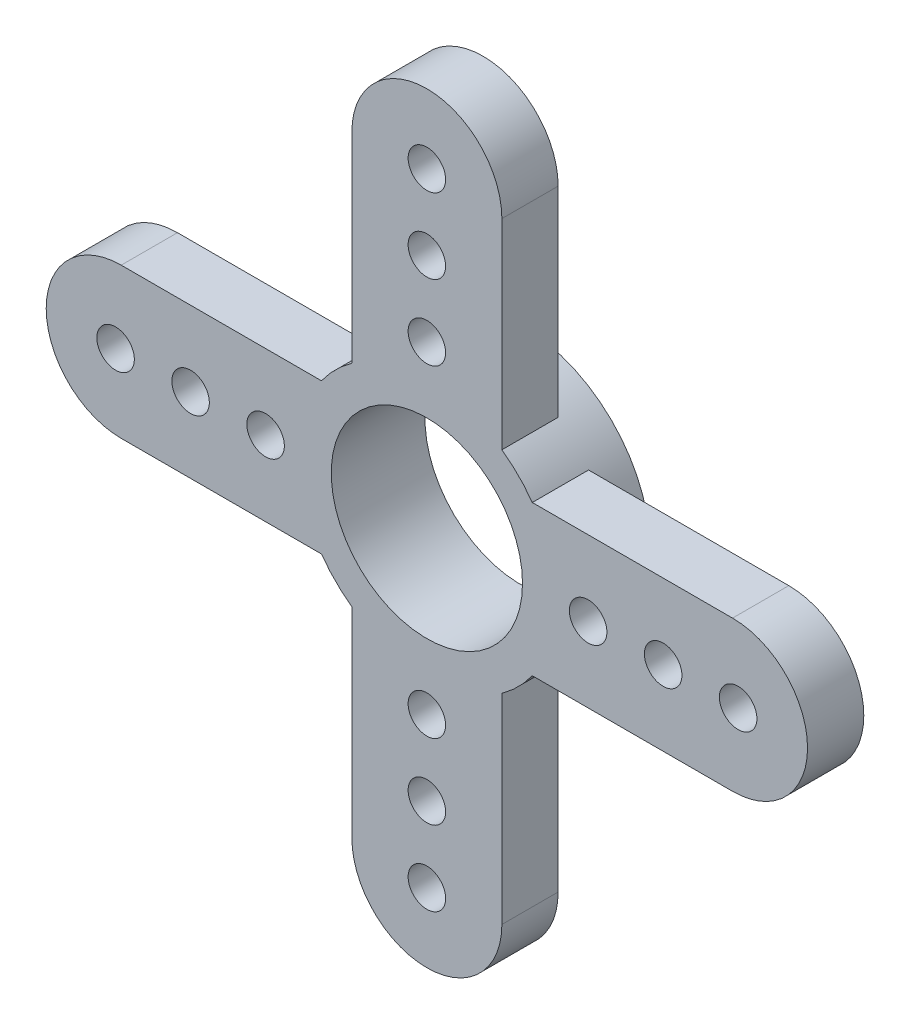
ISO-10303-21;
HEADER;
FILE_DESCRIPTION(('STEP AP214'),'2;1');
FILE_NAME('part.step','',(''),(''),'','','');
FILE_SCHEMA(('AUTOMOTIVE_DESIGN { 1 0 10303 214 1 1 1 1 }'));
ENDSEC;
DATA;
#1=APPLICATION_CONTEXT('core data for automotive mechanical design processes');
#2=APPLICATION_PROTOCOL_DEFINITION('international standard','automotive_design',2000,#1);
#3=PRODUCT_CONTEXT('',#1,'mechanical');
#4=PRODUCT('Part','Part','',(#3));
#5=PRODUCT_RELATED_PRODUCT_CATEGORY('part','',(#4));
#6=PRODUCT_DEFINITION_FORMATION('','',#4);
#7=PRODUCT_DEFINITION_CONTEXT('part definition',#1,'design');
#8=PRODUCT_DEFINITION('design','',#6,#7);
#9=PRODUCT_DEFINITION_SHAPE('','',#8);
#10=(LENGTH_UNIT() NAMED_UNIT(*) SI_UNIT(.MILLI.,.METRE.));
#11=(NAMED_UNIT(*) PLANE_ANGLE_UNIT() SI_UNIT($,.RADIAN.));
#12=(NAMED_UNIT(*) SI_UNIT($,.STERADIAN.) SOLID_ANGLE_UNIT());
#13=UNCERTAINTY_MEASURE_WITH_UNIT(LENGTH_MEASURE(1.E-05),#10,'distance_accuracy_value','');
#14=(GEOMETRIC_REPRESENTATION_CONTEXT(3) GLOBAL_UNCERTAINTY_ASSIGNED_CONTEXT((#13)) GLOBAL_UNIT_ASSIGNED_CONTEXT((#10,
#11,#12)) REPRESENTATION_CONTEXT('',''));
#15=CARTESIAN_POINT('',(0.,0.,0.));
#16=DIRECTION('',(0.,0.,1.));
#17=DIRECTION('',(1.,0.,0.));
#18=AXIS2_PLACEMENT_3D('',#15,#16,#17);
#19=CARTESIAN_POINT('',(0.,0.,0.));
#20=DIRECTION('',(0.,0.,1.));
#21=DIRECTION('',(1.,0.,0.));
#22=AXIS2_PLACEMENT_3D('',#19,#20,#21);
#23=PLANE('',#22);
#24=CARTESIAN_POINT('',(0.,4.3,0.));
#25=DIRECTION('',(0.,0.,1.));
#26=DIRECTION('',(1.,0.,0.));
#27=AXIS2_PLACEMENT_3D('',#24,#25,#26);
#28=CIRCLE('',#27,0.5);
#29=CARTESIAN_POINT('',(0.5,4.3,0.));
#30=VERTEX_POINT('',#29);
#31=EDGE_CURVE('E262',#30,#30,#28,.F.);
#32=ORIENTED_EDGE('',*,*,#31,.F.);
#33=EDGE_LOOP('',(#32));
#34=FACE_BOUND('',#33,.T.);
#35=CARTESIAN_POINT('',(0.,6.3,0.));
#36=DIRECTION('',(0.,0.,1.));
#37=DIRECTION('',(1.,0.,0.));
#38=AXIS2_PLACEMENT_3D('',#35,#36,#37);
#39=CIRCLE('',#38,0.5);
#40=CARTESIAN_POINT('',(0.5,6.3,0.));
#41=VERTEX_POINT('',#40);
#42=EDGE_CURVE('E259',#41,#41,#39,.F.);
#43=ORIENTED_EDGE('',*,*,#42,.F.);
#44=EDGE_LOOP('',(#43));
#45=FACE_BOUND('',#44,.T.);
#46=CARTESIAN_POINT('',(0.,8.3,0.));
#47=DIRECTION('',(0.,0.,1.));
#48=DIRECTION('',(1.,0.,0.));
#49=AXIS2_PLACEMENT_3D('',#46,#47,#48);
#50=CIRCLE('',#49,0.5);
#51=CARTESIAN_POINT('',(0.5,8.3,0.));
#52=VERTEX_POINT('',#51);
#53=EDGE_CURVE('E254',#52,#52,#50,.F.);
#54=ORIENTED_EDGE('',*,*,#53,.F.);
#55=EDGE_LOOP('',(#54));
#56=FACE_BOUND('',#55,.T.);
#57=DIRECTION('',(0.,1.,0.));
#58=VECTOR('',#57,1.);
#59=CARTESIAN_POINT('',(2.,-8.15,0.));
#60=LINE('',#59,#58);
#61=CARTESIAN_POINT('',(2.,2.81113855937412,0.));
#62=VERTEX_POINT('',#61);
#63=CARTESIAN_POINT('',(2.,8.15,0.));
#64=VERTEX_POINT('',#63);
#65=EDGE_CURVE('E169',#62,#64,#60,.T.);
#66=ORIENTED_EDGE('',*,*,#65,.F.);
#67=CARTESIAN_POINT('',(0.,0.,0.));
#68=DIRECTION('',(0.,0.,1.));
#69=DIRECTION('',(1.,0.,0.));
#70=AXIS2_PLACEMENT_3D('',#67,#68,#69);
#71=CIRCLE('',#70,3.45);
#72=CARTESIAN_POINT('',(-2.,2.81113855937412,0.));
#73=VERTEX_POINT('',#72);
#74=EDGE_CURVE('E11',#62,#73,#71,.T.);
#75=ORIENTED_EDGE('',*,*,#74,.T.);
#76=DIRECTION('',(0.,-1.,0.));
#77=VECTOR('',#76,1.);
#78=CARTESIAN_POINT('',(-2.,-8.15,0.));
#79=LINE('',#78,#77);
#80=CARTESIAN_POINT('',(-2.,8.15,0.));
#81=VERTEX_POINT('',#80);
#82=EDGE_CURVE('E179',#81,#73,#79,.T.);
#83=ORIENTED_EDGE('',*,*,#82,.F.);
#84=CARTESIAN_POINT('',(0.,8.15,0.));
#85=DIRECTION('',(0.,0.,1.));
#86=DIRECTION('',(1.,0.,0.));
#87=AXIS2_PLACEMENT_3D('',#84,#85,#86);
#88=CIRCLE('',#87,2.);
#89=EDGE_CURVE('E176',#64,#81,#88,.T.);
#90=ORIENTED_EDGE('',*,*,#89,.F.);
#91=EDGE_LOOP('',(#66,#75,#83,#90));
#92=FACE_BOUND('',#91,.T.);
#93=ADVANCED_FACE('F43',(#34,#45,#56,#92),#23,.F.);
#94=CARTESIAN_POINT('',(-8.3,0.,0.));
#95=DIRECTION('',(0.,0.,1.));
#96=DIRECTION('',(1.,0.,0.));
#97=AXIS2_PLACEMENT_3D('',#94,#95,#96);
#98=CIRCLE('',#97,0.5);
#99=CARTESIAN_POINT('',(-7.8,0.,0.));
#100=VERTEX_POINT('',#99);
#101=EDGE_CURVE('E287',#100,#100,#98,.F.);
#102=ORIENTED_EDGE('',*,*,#101,.F.);
#103=EDGE_LOOP('',(#102));
#104=FACE_BOUND('',#103,.T.);
#105=CARTESIAN_POINT('',(-4.3,0.,0.));
#106=DIRECTION('',(0.,0.,1.));
#107=DIRECTION('',(1.,0.,0.));
#108=AXIS2_PLACEMENT_3D('',#105,#106,#107);
#109=CIRCLE('',#108,0.5);
#110=CARTESIAN_POINT('',(-3.8,0.,0.));
#111=VERTEX_POINT('',#110);
#112=EDGE_CURVE('E274',#111,#111,#109,.F.);
#113=ORIENTED_EDGE('',*,*,#112,.F.);
#114=EDGE_LOOP('',(#113));
#115=FACE_BOUND('',#114,.T.);
#116=CARTESIAN_POINT('',(-6.3,0.,0.));
#117=DIRECTION('',(0.,0.,1.));
#118=DIRECTION('',(1.,0.,0.));
#119=AXIS2_PLACEMENT_3D('',#116,#117,#118);
#120=CIRCLE('',#119,0.5);
#121=CARTESIAN_POINT('',(-5.8,0.,0.));
#122=VERTEX_POINT('',#121);
#123=EDGE_CURVE('E275',#122,#122,#120,.F.);
#124=ORIENTED_EDGE('',*,*,#123,.F.);
#125=EDGE_LOOP('',(#124));
#126=FACE_BOUND('',#125,.T.);
#127=DIRECTION('',(-1.,0.,0.));
#128=VECTOR('',#127,1.);
#129=CARTESIAN_POINT('',(-8.15,2.,0.));
#130=LINE('',#129,#128);
#131=CARTESIAN_POINT('',(-2.81113855937412,2.,0.));
#132=VERTEX_POINT('',#131);
#133=CARTESIAN_POINT('',(-8.15,2.,0.));
#134=VERTEX_POINT('',#133);
#135=EDGE_CURVE('E215',#132,#134,#130,.T.);
#136=ORIENTED_EDGE('',*,*,#135,.F.);
#137=CARTESIAN_POINT('',(-2.81113855937412,-2.,0.));
#138=VERTEX_POINT('',#137);
#139=EDGE_CURVE('E55',#132,#138,#71,.T.);
#140=ORIENTED_EDGE('',*,*,#139,.T.);
#141=DIRECTION('',(1.,0.,0.));
#142=VECTOR('',#141,1.);
#143=CARTESIAN_POINT('',(-8.15,-2.,0.));
#144=LINE('',#143,#142);
#145=CARTESIAN_POINT('',(-8.15,-2.,0.));
#146=VERTEX_POINT('',#145);
#147=EDGE_CURVE('E207',#146,#138,#144,.T.);
#148=ORIENTED_EDGE('',*,*,#147,.F.);
#149=CARTESIAN_POINT('',(-8.15,0.,0.));
#150=DIRECTION('',(0.,0.,1.));
#151=DIRECTION('',(1.,0.,0.));
#152=AXIS2_PLACEMENT_3D('',#149,#150,#151);
#153=CIRCLE('',#152,2.);
#154=EDGE_CURVE('E301',#134,#146,#153,.T.);
#155=ORIENTED_EDGE('',*,*,#154,.F.);
#156=EDGE_LOOP('',(#136,#140,#148,#155));
#157=FACE_BOUND('',#156,.T.);
#158=ADVANCED_FACE('F365',(#104,#115,#126,#157),#23,.F.);
#159=CARTESIAN_POINT('',(0.,-8.3,0.));
#160=DIRECTION('',(0.,0.,1.));
#161=DIRECTION('',(1.,0.,0.));
#162=AXIS2_PLACEMENT_3D('',#159,#160,#161);
#163=CIRCLE('',#162,0.5);
#164=CARTESIAN_POINT('',(0.5,-8.3,0.));
#165=VERTEX_POINT('',#164);
#166=EDGE_CURVE('E283',#165,#165,#163,.F.);
#167=ORIENTED_EDGE('',*,*,#166,.F.);
#168=EDGE_LOOP('',(#167));
#169=FACE_BOUND('',#168,.T.);
#170=CARTESIAN_POINT('',(0.,-6.3,0.));
#171=DIRECTION('',(0.,0.,1.));
#172=DIRECTION('',(1.,0.,0.));
#173=AXIS2_PLACEMENT_3D('',#170,#171,#172);
#174=CIRCLE('',#173,0.5);
#175=CARTESIAN_POINT('',(0.5,-6.3,0.));
#176=VERTEX_POINT('',#175);
#177=EDGE_CURVE('E284',#176,#176,#174,.F.);
#178=ORIENTED_EDGE('',*,*,#177,.F.);
#179=EDGE_LOOP('',(#178));
#180=FACE_BOUND('',#179,.T.);
#181=CARTESIAN_POINT('',(0.,-4.3,0.));
#182=DIRECTION('',(0.,0.,1.));
#183=DIRECTION('',(1.,0.,0.));
#184=AXIS2_PLACEMENT_3D('',#181,#182,#183);
#185=CIRCLE('',#184,0.5);
#186=CARTESIAN_POINT('',(0.5,-4.3,0.));
#187=VERTEX_POINT('',#186);
#188=EDGE_CURVE('E279',#187,#187,#185,.F.);
#189=ORIENTED_EDGE('',*,*,#188,.F.);
#190=EDGE_LOOP('',(#189));
#191=FACE_BOUND('',#190,.T.);
#192=CARTESIAN_POINT('',(-2.,-2.81113855937412,0.));
#193=VERTEX_POINT('',#192);
#194=CARTESIAN_POINT('',(-2.,-8.15,0.));
#195=VERTEX_POINT('',#194);
#196=EDGE_CURVE('E185',#193,#195,#79,.T.);
#197=ORIENTED_EDGE('',*,*,#196,.F.);
#198=CARTESIAN_POINT('',(2.,-2.81113855937412,0.));
#199=VERTEX_POINT('',#198);
#200=EDGE_CURVE('E358',#193,#199,#71,.T.);
#201=ORIENTED_EDGE('',*,*,#200,.T.);
#202=CARTESIAN_POINT('',(2.,-8.15,0.));
#203=VERTEX_POINT('',#202);
#204=EDGE_CURVE('E177',#203,#199,#60,.T.);
#205=ORIENTED_EDGE('',*,*,#204,.F.);
#206=CARTESIAN_POINT('',(0.,-8.15,0.));
#207=DIRECTION('',(0.,0.,1.));
#208=DIRECTION('',(1.,0.,0.));
#209=AXIS2_PLACEMENT_3D('',#206,#207,#208);
#210=CIRCLE('',#209,2.);
#211=EDGE_CURVE('E313',#195,#203,#210,.T.);
#212=ORIENTED_EDGE('',*,*,#211,.F.);
#213=EDGE_LOOP('',(#197,#201,#205,#212));
#214=FACE_BOUND('',#213,.T.);
#215=ADVANCED_FACE('F368',(#169,#180,#191,#214),#23,.F.);
#216=CARTESIAN_POINT('',(0.,0.,1.5));
#217=DIRECTION('',(0.,0.,-1.));
#218=DIRECTION('',(-1.,0.,0.));
#219=AXIS2_PLACEMENT_3D('',#216,#217,#218);
#220=CYLINDRICAL_SURFACE('',#219,3.45);
#221=DIRECTION('',(0.,0.,-1.));
#222=VECTOR('',#221,1.);
#223=CARTESIAN_POINT('',(2.,2.81113855937412,1.5));
#224=LINE('',#223,#222);
#225=CARTESIAN_POINT('',(2.,2.81113855937412,1.5));
#226=VERTEX_POINT('',#225);
#227=EDGE_CURVE('E160',#226,#62,#224,.T.);
#228=ORIENTED_EDGE('',*,*,#227,.F.);
#229=CARTESIAN_POINT('',(0.,0.,1.5));
#230=DIRECTION('',(0.,0.,1.));
#231=DIRECTION('',(1.,0.,0.));
#232=AXIS2_PLACEMENT_3D('',#229,#230,#231);
#233=CIRCLE('',#232,3.45);
#234=CARTESIAN_POINT('',(2.81113855937412,2.,1.5));
#235=VERTEX_POINT('',#234);
#236=EDGE_CURVE('E239',#235,#226,#233,.T.);
#237=ORIENTED_EDGE('',*,*,#236,.F.);
#238=DIRECTION('',(0.,0.,-1.));
#239=VECTOR('',#238,1.);
#240=CARTESIAN_POINT('',(2.81113855937412,2.,1.5));
#241=LINE('',#240,#239);
#242=CARTESIAN_POINT('',(2.81113855937412,2.,0.));
#243=VERTEX_POINT('',#242);
#244=EDGE_CURVE('E229',#243,#235,#241,.F.);
#245=ORIENTED_EDGE('',*,*,#244,.F.);
#246=CARTESIAN_POINT('',(2.81113855937412,-2.,0.));
#247=VERTEX_POINT('',#246);
#248=EDGE_CURVE('E53',#247,#243,#71,.T.);
#249=ORIENTED_EDGE('',*,*,#248,.F.);
#250=DIRECTION('',(0.,0.,-1.));
#251=VECTOR('',#250,1.);
#252=CARTESIAN_POINT('',(2.81113855937412,-2.,1.5));
#253=LINE('',#252,#251);
#254=CARTESIAN_POINT('',(2.81113855937412,-2.,1.5));
#255=VERTEX_POINT('',#254);
#256=EDGE_CURVE('E235',#255,#247,#253,.T.);
#257=ORIENTED_EDGE('',*,*,#256,.F.);
#258=CARTESIAN_POINT('',(2.,-2.81113855937412,1.5));
#259=VERTEX_POINT('',#258);
#260=EDGE_CURVE('E236',#259,#255,#233,.T.);
#261=ORIENTED_EDGE('',*,*,#260,.F.);
#262=DIRECTION('',(0.,0.,-1.));
#263=VECTOR('',#262,1.);
#264=CARTESIAN_POINT('',(2.,-2.81113855937412,1.5));
#265=LINE('',#264,#263);
#266=EDGE_CURVE('E174',#199,#259,#265,.F.);
#267=ORIENTED_EDGE('',*,*,#266,.F.);
#268=ORIENTED_EDGE('',*,*,#200,.F.);
#269=DIRECTION('',(0.,0.,-1.));
#270=VECTOR('',#269,1.);
#271=CARTESIAN_POINT('',(-2.,-2.81113855937412,1.5));
#272=LINE('',#271,#270);
#273=CARTESIAN_POINT('',(-2.,-2.81113855937412,1.5));
#274=VERTEX_POINT('',#273);
#275=EDGE_CURVE('E64',#274,#193,#272,.T.);
#276=ORIENTED_EDGE('',*,*,#275,.F.);
#277=CARTESIAN_POINT('',(-2.81113855937412,-2.,1.5));
#278=VERTEX_POINT('',#277);
#279=EDGE_CURVE('E244',#278,#274,#233,.T.);
#280=ORIENTED_EDGE('',*,*,#279,.F.);
#281=DIRECTION('',(0.,0.,-1.));
#282=VECTOR('',#281,1.);
#283=CARTESIAN_POINT('',(-2.81113855937412,-2.,1.5));
#284=LINE('',#283,#282);
#285=EDGE_CURVE('E232',#138,#278,#284,.F.);
#286=ORIENTED_EDGE('',*,*,#285,.F.);
#287=ORIENTED_EDGE('',*,*,#139,.F.);
#288=DIRECTION('',(0.,0.,-1.));
#289=VECTOR('',#288,1.);
#290=CARTESIAN_POINT('',(-2.81113855937412,2.,1.5));
#291=LINE('',#290,#289);
#292=CARTESIAN_POINT('',(-2.81113855937412,2.,1.5));
#293=VERTEX_POINT('',#292);
#294=EDGE_CURVE('E228',#293,#132,#291,.T.);
#295=ORIENTED_EDGE('',*,*,#294,.F.);
#296=CARTESIAN_POINT('',(-2.,2.81113855937412,1.5));
#297=VERTEX_POINT('',#296);
#298=EDGE_CURVE('E69',#297,#293,#233,.T.);
#299=ORIENTED_EDGE('',*,*,#298,.F.);
#300=DIRECTION('',(0.,0.,-1.));
#301=VECTOR('',#300,1.);
#302=CARTESIAN_POINT('',(-2.,2.81113855937412,1.5));
#303=LINE('',#302,#301);
#304=EDGE_CURVE('E157',#73,#297,#303,.F.);
#305=ORIENTED_EDGE('',*,*,#304,.F.);
#306=ORIENTED_EDGE('',*,*,#74,.F.);
#307=EDGE_LOOP('',(#228,#237,#245,#249,#257,#261,#267,#268,#276,#280,#286,#287,#295,#299,#305,#306));
#308=FACE_BOUND('',#307,.T.);
#309=CARTESIAN_POINT('',(0.,0.,-1.));
#310=DIRECTION('',(0.,0.,1.));
#311=DIRECTION('',(1.,0.,0.));
#312=AXIS2_PLACEMENT_3D('',#309,#310,#311);
#313=CIRCLE('',#312,3.45);
#314=CARTESIAN_POINT('',(3.45,0.,-1.));
#315=VERTEX_POINT('',#314);
#316=EDGE_CURVE('E242',#315,#315,#313,.T.);
#317=ORIENTED_EDGE('',*,*,#316,.T.);
#318=EDGE_LOOP('',(#317));
#319=FACE_BOUND('',#318,.T.);
#320=ADVANCED_FACE('F44',(#308,#319),#220,.T.);
#321=CARTESIAN_POINT('',(0.,0.,1.5));
#322=DIRECTION('',(0.,0.,1.));
#323=DIRECTION('',(1.,0.,0.));
#324=AXIS2_PLACEMENT_3D('',#321,#322,#323);
#325=PLANE('',#324);
#326=CARTESIAN_POINT('',(-8.3,0.,1.5));
#327=DIRECTION('',(0.,0.,1.));
#328=DIRECTION('',(1.,0.,0.));
#329=AXIS2_PLACEMENT_3D('',#326,#327,#328);
#330=CIRCLE('',#329,0.5);
#331=CARTESIAN_POINT('',(-7.8,0.,1.5));
#332=VERTEX_POINT('',#331);
#333=EDGE_CURVE('E250',#332,#332,#330,.T.);
#334=ORIENTED_EDGE('',*,*,#333,.F.);
#335=EDGE_LOOP('',(#334));
#336=FACE_BOUND('',#335,.T.);
#337=CARTESIAN_POINT('',(8.3,0.,1.5));
#338=DIRECTION('',(0.,0.,1.));
#339=DIRECTION('',(1.,0.,0.));
#340=AXIS2_PLACEMENT_3D('',#337,#338,#339);
#341=CIRCLE('',#340,0.5);
#342=CARTESIAN_POINT('',(8.8,0.,1.5));
#343=VERTEX_POINT('',#342);
#344=EDGE_CURVE('E476',#343,#343,#341,.T.);
#345=ORIENTED_EDGE('',*,*,#344,.F.);
#346=EDGE_LOOP('',(#345));
#347=FACE_BOUND('',#346,.T.);
#348=CARTESIAN_POINT('',(0.,-8.3,1.5));
#349=DIRECTION('',(0.,0.,1.));
#350=DIRECTION('',(1.,0.,0.));
#351=AXIS2_PLACEMENT_3D('',#348,#349,#350);
#352=CIRCLE('',#351,0.5);
#353=CARTESIAN_POINT('',(0.5,-8.3,1.5));
#354=VERTEX_POINT('',#353);
#355=EDGE_CURVE('E471',#354,#354,#352,.T.);
#356=ORIENTED_EDGE('',*,*,#355,.F.);
#357=EDGE_LOOP('',(#356));
#358=FACE_BOUND('',#357,.T.);
#359=CARTESIAN_POINT('',(0.,-6.3,1.5));
#360=DIRECTION('',(0.,0.,1.));
#361=DIRECTION('',(1.,0.,0.));
#362=AXIS2_PLACEMENT_3D('',#359,#360,#361);
#363=CIRCLE('',#362,0.5);
#364=CARTESIAN_POINT('',(0.5,-6.3,1.5));
#365=VERTEX_POINT('',#364);
#366=EDGE_CURVE('E470',#365,#365,#363,.T.);
#367=ORIENTED_EDGE('',*,*,#366,.F.);
#368=EDGE_LOOP('',(#367));
#369=FACE_BOUND('',#368,.T.);
#370=CARTESIAN_POINT('',(0.,-4.3,1.5));
#371=DIRECTION('',(0.,0.,1.));
#372=DIRECTION('',(1.,0.,0.));
#373=AXIS2_PLACEMENT_3D('',#370,#371,#372);
#374=CIRCLE('',#373,0.5);
#375=CARTESIAN_POINT('',(0.5,-4.3,1.5));
#376=VERTEX_POINT('',#375);
#377=EDGE_CURVE('E475',#376,#376,#374,.T.);
#378=ORIENTED_EDGE('',*,*,#377,.F.);
#379=EDGE_LOOP('',(#378));
#380=FACE_BOUND('',#379,.T.);
#381=CARTESIAN_POINT('',(6.3,0.,1.5));
#382=DIRECTION('',(0.,0.,1.));
#383=DIRECTION('',(1.,0.,0.));
#384=AXIS2_PLACEMENT_3D('',#381,#382,#383);
#385=CIRCLE('',#384,0.5);
#386=CARTESIAN_POINT('',(6.8,0.,1.5));
#387=VERTEX_POINT('',#386);
#388=EDGE_CURVE('E481',#387,#387,#385,.T.);
#389=ORIENTED_EDGE('',*,*,#388,.F.);
#390=EDGE_LOOP('',(#389));
#391=FACE_BOUND('',#390,.T.);
#392=CARTESIAN_POINT('',(4.3,0.,1.5));
#393=DIRECTION('',(0.,0.,1.));
#394=DIRECTION('',(1.,0.,0.));
#395=AXIS2_PLACEMENT_3D('',#392,#393,#394);
#396=CIRCLE('',#395,0.5);
#397=CARTESIAN_POINT('',(4.8,0.,1.5));
#398=VERTEX_POINT('',#397);
#399=EDGE_CURVE('E486',#398,#398,#396,.T.);
#400=ORIENTED_EDGE('',*,*,#399,.F.);
#401=EDGE_LOOP('',(#400));
#402=FACE_BOUND('',#401,.T.);
#403=CARTESIAN_POINT('',(-4.3,0.,1.5));
#404=DIRECTION('',(0.,0.,1.));
#405=DIRECTION('',(1.,0.,0.));
#406=AXIS2_PLACEMENT_3D('',#403,#404,#405);
#407=CIRCLE('',#406,0.5);
#408=CARTESIAN_POINT('',(-3.8,0.,1.5));
#409=VERTEX_POINT('',#408);
#410=EDGE_CURVE('E467',#409,#409,#407,.T.);
#411=ORIENTED_EDGE('',*,*,#410,.F.);
#412=EDGE_LOOP('',(#411));
#413=FACE_BOUND('',#412,.T.);
#414=CARTESIAN_POINT('',(-6.3,0.,1.5));
#415=DIRECTION('',(0.,0.,1.));
#416=DIRECTION('',(1.,0.,0.));
#417=AXIS2_PLACEMENT_3D('',#414,#415,#416);
#418=CIRCLE('',#417,0.5);
#419=CARTESIAN_POINT('',(-5.8,0.,1.5));
#420=VERTEX_POINT('',#419);
#421=EDGE_CURVE('E463',#420,#420,#418,.T.);
#422=ORIENTED_EDGE('',*,*,#421,.F.);
#423=EDGE_LOOP('',(#422));
#424=FACE_BOUND('',#423,.T.);
#425=CARTESIAN_POINT('',(0.,4.3,1.5));
#426=DIRECTION('',(0.,0.,1.));
#427=DIRECTION('',(1.,0.,0.));
#428=AXIS2_PLACEMENT_3D('',#425,#426,#427);
#429=CIRCLE('',#428,0.5);
#430=CARTESIAN_POINT('',(0.5,4.3,1.5));
#431=VERTEX_POINT('',#430);
#432=EDGE_CURVE('E480',#431,#431,#429,.T.);
#433=ORIENTED_EDGE('',*,*,#432,.F.);
#434=EDGE_LOOP('',(#433));
#435=FACE_BOUND('',#434,.T.);
#436=CARTESIAN_POINT('',(0.,6.3,1.5));
#437=DIRECTION('',(0.,0.,1.));
#438=DIRECTION('',(1.,0.,0.));
#439=AXIS2_PLACEMENT_3D('',#436,#437,#438);
#440=CIRCLE('',#439,0.5);
#441=CARTESIAN_POINT('',(0.5,6.3,1.5));
#442=VERTEX_POINT('',#441);
#443=EDGE_CURVE('E495',#442,#442,#440,.T.);
#444=ORIENTED_EDGE('',*,*,#443,.F.);
#445=EDGE_LOOP('',(#444));
#446=FACE_BOUND('',#445,.T.);
#447=CARTESIAN_POINT('',(0.,8.3,1.5));
#448=DIRECTION('',(0.,0.,1.));
#449=DIRECTION('',(1.,0.,0.));
#450=AXIS2_PLACEMENT_3D('',#447,#448,#449);
#451=CIRCLE('',#450,0.5);
#452=CARTESIAN_POINT('',(0.5,8.3,1.5));
#453=VERTEX_POINT('',#452);
#454=EDGE_CURVE('E270',#453,#453,#451,.T.);
#455=ORIENTED_EDGE('',*,*,#454,.F.);
#456=EDGE_LOOP('',(#455));
#457=FACE_BOUND('',#456,.T.);
#458=CARTESIAN_POINT('',(0.,0.,1.5));
#459=DIRECTION('',(0.,0.,1.));
#460=DIRECTION('',(1.,0.,0.));
#461=AXIS2_PLACEMENT_3D('',#458,#459,#460);
#462=CIRCLE('',#461,2.55);
#463=CARTESIAN_POINT('',(2.55,0.,1.5));
#464=VERTEX_POINT('',#463);
#465=EDGE_CURVE('E246',#464,#464,#462,.T.);
#466=ORIENTED_EDGE('',*,*,#465,.F.);
#467=EDGE_LOOP('',(#466));
#468=FACE_BOUND('',#467,.T.);
#469=DIRECTION('',(0.,-1.,0.));
#470=VECTOR('',#469,1.);
#471=CARTESIAN_POINT('',(-2.,-8.15,1.5));
#472=LINE('',#471,#470);
#473=CARTESIAN_POINT('',(-2.,-8.15,1.5));
#474=VERTEX_POINT('',#473);
#475=EDGE_CURVE('E182',#274,#474,#472,.T.);
#476=ORIENTED_EDGE('',*,*,#475,.T.);
#477=CARTESIAN_POINT('',(0.,-8.15,1.5));
#478=DIRECTION('',(0.,0.,1.));
#479=DIRECTION('',(1.,0.,0.));
#480=AXIS2_PLACEMENT_3D('',#477,#478,#479);
#481=CIRCLE('',#480,2.);
#482=CARTESIAN_POINT('',(2.,-8.15,1.5));
#483=VERTEX_POINT('',#482);
#484=EDGE_CURVE('E294',#474,#483,#481,.T.);
#485=ORIENTED_EDGE('',*,*,#484,.T.);
#486=DIRECTION('',(0.,1.,0.));
#487=VECTOR('',#486,1.);
#488=CARTESIAN_POINT('',(2.,-8.15,1.5));
#489=LINE('',#488,#487);
#490=EDGE_CURVE('E188',#483,#259,#489,.T.);
#491=ORIENTED_EDGE('',*,*,#490,.T.);
#492=ORIENTED_EDGE('',*,*,#260,.T.);
#493=DIRECTION('',(1.,0.,0.));
#494=VECTOR('',#493,1.);
#495=CARTESIAN_POINT('',(-8.15,-2.,1.5));
#496=LINE('',#495,#494);
#497=CARTESIAN_POINT('',(8.15,-2.,1.5));
#498=VERTEX_POINT('',#497);
#499=EDGE_CURVE('E204',#255,#498,#496,.T.);
#500=ORIENTED_EDGE('',*,*,#499,.T.);
#501=CARTESIAN_POINT('',(8.15,0.,1.5));
#502=DIRECTION('',(0.,0.,1.));
#503=DIRECTION('',(1.,0.,0.));
#504=AXIS2_PLACEMENT_3D('',#501,#502,#503);
#505=CIRCLE('',#504,2.);
#506=CARTESIAN_POINT('',(8.15,2.,1.5));
#507=VERTEX_POINT('',#506);
#508=EDGE_CURVE('E293',#498,#507,#505,.T.);
#509=ORIENTED_EDGE('',*,*,#508,.T.);
#510=DIRECTION('',(-1.,0.,0.));
#511=VECTOR('',#510,1.);
#512=CARTESIAN_POINT('',(-8.15,2.,1.5));
#513=LINE('',#512,#511);
#514=EDGE_CURVE('E202',#507,#235,#513,.T.);
#515=ORIENTED_EDGE('',*,*,#514,.T.);
#516=ORIENTED_EDGE('',*,*,#236,.T.);
#517=CARTESIAN_POINT('',(2.,8.15,1.5));
#518=VERTEX_POINT('',#517);
#519=EDGE_CURVE('E168',#226,#518,#489,.T.);
#520=ORIENTED_EDGE('',*,*,#519,.T.);
#521=CARTESIAN_POINT('',(0.,8.15,1.5));
#522=DIRECTION('',(0.,0.,1.));
#523=DIRECTION('',(1.,0.,0.));
#524=AXIS2_PLACEMENT_3D('',#521,#522,#523);
#525=CIRCLE('',#524,2.);
#526=CARTESIAN_POINT('',(-2.,8.15,1.5));
#527=VERTEX_POINT('',#526);
#528=EDGE_CURVE('E306',#518,#527,#525,.T.);
#529=ORIENTED_EDGE('',*,*,#528,.T.);
#530=EDGE_CURVE('E316',#527,#297,#472,.T.);
#531=ORIENTED_EDGE('',*,*,#530,.T.);
#532=ORIENTED_EDGE('',*,*,#298,.T.);
#533=CARTESIAN_POINT('',(-8.15,2.,1.5));
#534=VERTEX_POINT('',#533);
#535=EDGE_CURVE('E201',#293,#534,#513,.T.);
#536=ORIENTED_EDGE('',*,*,#535,.T.);
#537=CARTESIAN_POINT('',(-8.15,0.,1.5));
#538=DIRECTION('',(0.,0.,1.));
#539=DIRECTION('',(1.,0.,0.));
#540=AXIS2_PLACEMENT_3D('',#537,#538,#539);
#541=CIRCLE('',#540,2.);
#542=CARTESIAN_POINT('',(-8.15,-2.,1.5));
#543=VERTEX_POINT('',#542);
#544=EDGE_CURVE('E303',#534,#543,#541,.T.);
#545=ORIENTED_EDGE('',*,*,#544,.T.);
#546=EDGE_CURVE('E199',#543,#278,#496,.T.);
#547=ORIENTED_EDGE('',*,*,#546,.T.);
#548=ORIENTED_EDGE('',*,*,#279,.T.);
#549=EDGE_LOOP('',(#476,#485,#491,#492,#500,#509,#515,#516,#520,#529,#531,#532,#536,#545,#547,#548));
#550=FACE_BOUND('',#549,.T.);
#551=ADVANCED_FACE('F319',(#336,#347,#358,#369,#380,#391,#402,#413,#424,#435,#446,#457,#468,
#550),#325,.T.);
#552=CARTESIAN_POINT('',(8.3,0.,0.));
#553=DIRECTION('',(0.,0.,1.));
#554=DIRECTION('',(1.,0.,0.));
#555=AXIS2_PLACEMENT_3D('',#552,#553,#554);
#556=CIRCLE('',#555,0.5);
#557=CARTESIAN_POINT('',(8.8,0.,0.));
#558=VERTEX_POINT('',#557);
#559=EDGE_CURVE('E50',#558,#558,#556,.F.);
#560=ORIENTED_EDGE('',*,*,#559,.F.);
#561=EDGE_LOOP('',(#560));
#562=FACE_BOUND('',#561,.T.);
#563=CARTESIAN_POINT('',(6.3,0.,0.));
#564=DIRECTION('',(0.,0.,1.));
#565=DIRECTION('',(1.,0.,0.));
#566=AXIS2_PLACEMENT_3D('',#563,#564,#565);
#567=CIRCLE('',#566,0.5);
#568=CARTESIAN_POINT('',(6.8,0.,0.));
#569=VERTEX_POINT('',#568);
#570=EDGE_CURVE('E248',#569,#569,#567,.F.);
#571=ORIENTED_EDGE('',*,*,#570,.F.);
#572=EDGE_LOOP('',(#571));
#573=FACE_BOUND('',#572,.T.);
#574=CARTESIAN_POINT('',(4.3,0.,0.));
#575=DIRECTION('',(0.,0.,1.));
#576=DIRECTION('',(1.,0.,0.));
#577=AXIS2_PLACEMENT_3D('',#574,#575,#576);
#578=CIRCLE('',#577,0.5);
#579=CARTESIAN_POINT('',(4.8,0.,0.));
#580=VERTEX_POINT('',#579);
#581=EDGE_CURVE('E247',#580,#580,#578,.F.);
#582=ORIENTED_EDGE('',*,*,#581,.F.);
#583=EDGE_LOOP('',(#582));
#584=FACE_BOUND('',#583,.T.);
#585=CARTESIAN_POINT('',(8.15,-2.,0.));
#586=VERTEX_POINT('',#585);
#587=EDGE_CURVE('E200',#247,#586,#144,.T.);
#588=ORIENTED_EDGE('',*,*,#587,.F.);
#589=ORIENTED_EDGE('',*,*,#248,.T.);
#590=CARTESIAN_POINT('',(8.15,2.,0.));
#591=VERTEX_POINT('',#590);
#592=EDGE_CURVE('E213',#591,#243,#130,.T.);
#593=ORIENTED_EDGE('',*,*,#592,.F.);
#594=CARTESIAN_POINT('',(8.15,0.,0.));
#595=DIRECTION('',(0.,0.,1.));
#596=DIRECTION('',(1.,0.,0.));
#597=AXIS2_PLACEMENT_3D('',#594,#595,#596);
#598=CIRCLE('',#597,2.);
#599=EDGE_CURVE('E300',#586,#591,#598,.T.);
#600=ORIENTED_EDGE('',*,*,#599,.F.);
#601=EDGE_LOOP('',(#588,#589,#593,#600));
#602=FACE_BOUND('',#601,.T.);
#603=ADVANCED_FACE('F359',(#562,#573,#584,#602),#23,.F.);
#604=CARTESIAN_POINT('',(-8.15,2.,1.5));
#605=DIRECTION('',(0.,-1.,0.));
#606=DIRECTION('',(0.,0.,-1.));
#607=AXIS2_PLACEMENT_3D('',#604,#605,#606);
#608=PLANE('',#607);
#609=ORIENTED_EDGE('',*,*,#592,.T.);
#610=ORIENTED_EDGE('',*,*,#244,.T.);
#611=ORIENTED_EDGE('',*,*,#514,.F.);
#612=DIRECTION('',(0.,0.,-1.));
#613=VECTOR('',#612,1.);
#614=CARTESIAN_POINT('',(8.15,2.,1.5));
#615=LINE('',#614,#613);
#616=EDGE_CURVE('E217',#507,#591,#615,.T.);
#617=ORIENTED_EDGE('',*,*,#616,.T.);
#618=EDGE_LOOP('',(#609,#610,#611,#617));
#619=FACE_BOUND('',#618,.T.);
#620=ADVANCED_FACE('F352',(#619),#608,.F.);
#621=CARTESIAN_POINT('',(-8.15,-2.,1.5));
#622=DIRECTION('',(0.,1.,0.));
#623=DIRECTION('',(0.,0.,1.));
#624=AXIS2_PLACEMENT_3D('',#621,#622,#623);
#625=PLANE('',#624);
#626=ORIENTED_EDGE('',*,*,#499,.F.);
#627=ORIENTED_EDGE('',*,*,#256,.T.);
#628=ORIENTED_EDGE('',*,*,#587,.T.);
#629=DIRECTION('',(0.,0.,-1.));
#630=VECTOR('',#629,1.);
#631=CARTESIAN_POINT('',(8.15,-2.,1.5));
#632=LINE('',#631,#630);
#633=EDGE_CURVE('E219',#498,#586,#632,.T.);
#634=ORIENTED_EDGE('',*,*,#633,.F.);
#635=EDGE_LOOP('',(#626,#627,#628,#634));
#636=FACE_BOUND('',#635,.T.);
#637=ADVANCED_FACE('F346',(#636),#625,.F.);
#638=ORIENTED_EDGE('',*,*,#147,.T.);
#639=ORIENTED_EDGE('',*,*,#285,.T.);
#640=ORIENTED_EDGE('',*,*,#546,.F.);
#641=DIRECTION('',(0.,0.,-1.));
#642=VECTOR('',#641,1.);
#643=CARTESIAN_POINT('',(-8.15,-2.,1.5));
#644=LINE('',#643,#642);
#645=EDGE_CURVE('E224',#543,#146,#644,.T.);
#646=ORIENTED_EDGE('',*,*,#645,.T.);
#647=EDGE_LOOP('',(#638,#639,#640,#646));
#648=FACE_BOUND('',#647,.T.);
#649=ADVANCED_FACE('F337',(#648),#625,.F.);
#650=ORIENTED_EDGE('',*,*,#535,.F.);
#651=ORIENTED_EDGE('',*,*,#294,.T.);
#652=ORIENTED_EDGE('',*,*,#135,.T.);
#653=DIRECTION('',(0.,0.,-1.));
#654=VECTOR('',#653,1.);
#655=CARTESIAN_POINT('',(-8.15,2.,1.5));
#656=LINE('',#655,#654);
#657=EDGE_CURVE('E208',#534,#134,#656,.T.);
#658=ORIENTED_EDGE('',*,*,#657,.F.);
#659=EDGE_LOOP('',(#650,#651,#652,#658));
#660=FACE_BOUND('',#659,.T.);
#661=ADVANCED_FACE('F335',(#660),#608,.F.);
#662=CARTESIAN_POINT('',(-2.,-8.15,1.5));
#663=DIRECTION('',(1.,0.,0.));
#664=DIRECTION('',(0.,0.,-1.));
#665=AXIS2_PLACEMENT_3D('',#662,#663,#664);
#666=PLANE('',#665);
#667=ORIENTED_EDGE('',*,*,#82,.T.);
#668=ORIENTED_EDGE('',*,*,#304,.T.);
#669=ORIENTED_EDGE('',*,*,#530,.F.);
#670=DIRECTION('',(0.,0.,-1.));
#671=VECTOR('',#670,1.);
#672=CARTESIAN_POINT('',(-2.,8.15,1.5));
#673=LINE('',#672,#671);
#674=EDGE_CURVE('E189',#527,#81,#673,.T.);
#675=ORIENTED_EDGE('',*,*,#674,.T.);
#676=EDGE_LOOP('',(#667,#668,#669,#675));
#677=FACE_BOUND('',#676,.T.);
#678=ADVANCED_FACE('F326',(#677),#666,.F.);
#679=CARTESIAN_POINT('',(2.,-8.15,1.5));
#680=DIRECTION('',(-1.,0.,0.));
#681=DIRECTION('',(0.,0.,1.));
#682=AXIS2_PLACEMENT_3D('',#679,#680,#681);
#683=PLANE('',#682);
#684=ORIENTED_EDGE('',*,*,#519,.F.);
#685=ORIENTED_EDGE('',*,*,#227,.T.);
#686=ORIENTED_EDGE('',*,*,#65,.T.);
#687=DIRECTION('',(0.,0.,-1.));
#688=VECTOR('',#687,1.);
#689=CARTESIAN_POINT('',(2.,8.15,1.5));
#690=LINE('',#689,#688);
#691=EDGE_CURVE('E190',#518,#64,#690,.T.);
#692=ORIENTED_EDGE('',*,*,#691,.F.);
#693=EDGE_LOOP('',(#684,#685,#686,#692));
#694=FACE_BOUND('',#693,.T.);
#695=ADVANCED_FACE('F167',(#694),#683,.F.);
#696=ORIENTED_EDGE('',*,*,#475,.F.);
#697=ORIENTED_EDGE('',*,*,#275,.T.);
#698=ORIENTED_EDGE('',*,*,#196,.T.);
#699=DIRECTION('',(0.,0.,-1.));
#700=VECTOR('',#699,1.);
#701=CARTESIAN_POINT('',(-2.,-8.15,1.5));
#702=LINE('',#701,#700);
#703=EDGE_CURVE('E171',#474,#195,#702,.T.);
#704=ORIENTED_EDGE('',*,*,#703,.F.);
#705=EDGE_LOOP('',(#696,#697,#698,#704));
#706=FACE_BOUND('',#705,.T.);
#707=ADVANCED_FACE('F387',(#706),#666,.F.);
#708=ORIENTED_EDGE('',*,*,#204,.T.);
#709=ORIENTED_EDGE('',*,*,#266,.T.);
#710=ORIENTED_EDGE('',*,*,#490,.F.);
#711=DIRECTION('',(0.,0.,-1.));
#712=VECTOR('',#711,1.);
#713=CARTESIAN_POINT('',(2.,-8.15,1.5));
#714=LINE('',#713,#712);
#715=EDGE_CURVE('E191',#483,#203,#714,.T.);
#716=ORIENTED_EDGE('',*,*,#715,.T.);
#717=EDGE_LOOP('',(#708,#709,#710,#716));
#718=FACE_BOUND('',#717,.T.);
#719=ADVANCED_FACE('F386',(#718),#683,.F.);
#720=CARTESIAN_POINT('',(0.,-8.15,1.5));
#721=DIRECTION('',(0.,0.,-1.));
#722=DIRECTION('',(-1.,0.,0.));
#723=AXIS2_PLACEMENT_3D('',#720,#721,#722);
#724=CYLINDRICAL_SURFACE('',#723,2.);
#725=ORIENTED_EDGE('',*,*,#211,.T.);
#726=ORIENTED_EDGE('',*,*,#715,.F.);
#727=ORIENTED_EDGE('',*,*,#484,.F.);
#728=ORIENTED_EDGE('',*,*,#703,.T.);
#729=EDGE_LOOP('',(#725,#726,#727,#728));
#730=FACE_BOUND('',#729,.T.);
#731=ADVANCED_FACE('F395',(#730),#724,.T.);
#732=CARTESIAN_POINT('',(0.,8.15,1.5));
#733=DIRECTION('',(0.,0.,-1.));
#734=DIRECTION('',(-1.,0.,0.));
#735=AXIS2_PLACEMENT_3D('',#732,#733,#734);
#736=CYLINDRICAL_SURFACE('',#735,2.);
#737=ORIENTED_EDGE('',*,*,#89,.T.);
#738=ORIENTED_EDGE('',*,*,#674,.F.);
#739=ORIENTED_EDGE('',*,*,#528,.F.);
#740=ORIENTED_EDGE('',*,*,#691,.T.);
#741=EDGE_LOOP('',(#737,#738,#739,#740));
#742=FACE_BOUND('',#741,.T.);
#743=ADVANCED_FACE('F322',(#742),#736,.T.);
#744=CARTESIAN_POINT('',(-8.15,0.,1.5));
#745=DIRECTION('',(0.,0.,-1.));
#746=DIRECTION('',(-1.,0.,0.));
#747=AXIS2_PLACEMENT_3D('',#744,#745,#746);
#748=CYLINDRICAL_SURFACE('',#747,2.);
#749=ORIENTED_EDGE('',*,*,#154,.T.);
#750=ORIENTED_EDGE('',*,*,#645,.F.);
#751=ORIENTED_EDGE('',*,*,#544,.F.);
#752=ORIENTED_EDGE('',*,*,#657,.T.);
#753=EDGE_LOOP('',(#749,#750,#751,#752));
#754=FACE_BOUND('',#753,.T.);
#755=ADVANCED_FACE('F336',(#754),#748,.T.);
#756=CARTESIAN_POINT('',(8.15,0.,1.5));
#757=DIRECTION('',(0.,0.,-1.));
#758=DIRECTION('',(-1.,0.,0.));
#759=AXIS2_PLACEMENT_3D('',#756,#757,#758);
#760=CYLINDRICAL_SURFACE('',#759,2.);
#761=ORIENTED_EDGE('',*,*,#599,.T.);
#762=ORIENTED_EDGE('',*,*,#616,.F.);
#763=ORIENTED_EDGE('',*,*,#508,.F.);
#764=ORIENTED_EDGE('',*,*,#633,.T.);
#765=EDGE_LOOP('',(#761,#762,#763,#764));
#766=FACE_BOUND('',#765,.T.);
#767=ADVANCED_FACE('F355',(#766),#760,.T.);
#768=CARTESIAN_POINT('',(0.,0.,-1.));
#769=DIRECTION('',(0.,0.,1.));
#770=DIRECTION('',(1.,0.,0.));
#771=AXIS2_PLACEMENT_3D('',#768,#769,#770);
#772=PLANE('',#771);
#773=CARTESIAN_POINT('',(0.,0.,-1.));
#774=DIRECTION('',(0.,0.,1.));
#775=DIRECTION('',(1.,0.,0.));
#776=AXIS2_PLACEMENT_3D('',#773,#774,#775);
#777=CIRCLE('',#776,2.55);
#778=CARTESIAN_POINT('',(2.55,0.,-1.));
#779=VERTEX_POINT('',#778);
#780=EDGE_CURVE('E241',#779,#779,#777,.F.);
#781=ORIENTED_EDGE('',*,*,#780,.F.);
#782=EDGE_LOOP('',(#781));
#783=FACE_BOUND('',#782,.T.);
#784=ORIENTED_EDGE('',*,*,#316,.F.);
#785=EDGE_LOOP('',(#784));
#786=FACE_BOUND('',#785,.T.);
#787=ADVANCED_FACE('F404',(#783,#786),#772,.F.);
#788=CARTESIAN_POINT('',(0.,0.,1.5));
#789=DIRECTION('',(0.,0.,-1.));
#790=DIRECTION('',(-1.,0.,0.));
#791=AXIS2_PLACEMENT_3D('',#788,#789,#790);
#792=CYLINDRICAL_SURFACE('',#791,2.55);
#793=ORIENTED_EDGE('',*,*,#465,.T.);
#794=EDGE_LOOP('',(#793));
#795=FACE_BOUND('',#794,.T.);
#796=ORIENTED_EDGE('',*,*,#780,.T.);
#797=EDGE_LOOP('',(#796));
#798=FACE_BOUND('',#797,.T.);
#799=ADVANCED_FACE('F406',(#795,#798),#792,.F.);
#800=CARTESIAN_POINT('',(4.3,0.,1.5));
#801=DIRECTION('',(0.,0.,-1.));
#802=DIRECTION('',(-1.,0.,0.));
#803=AXIS2_PLACEMENT_3D('',#800,#801,#802);
#804=CYLINDRICAL_SURFACE('',#803,0.5);
#805=ORIENTED_EDGE('',*,*,#399,.T.);
#806=EDGE_LOOP('',(#805));
#807=FACE_BOUND('',#806,.T.);
#808=ORIENTED_EDGE('',*,*,#581,.T.);
#809=EDGE_LOOP('',(#808));
#810=FACE_BOUND('',#809,.T.);
#811=ADVANCED_FACE('F411',(#807,#810),#804,.F.);
#812=CARTESIAN_POINT('',(6.3,0.,1.5));
#813=DIRECTION('',(0.,0.,-1.));
#814=DIRECTION('',(-1.,0.,0.));
#815=AXIS2_PLACEMENT_3D('',#812,#813,#814);
#816=CYLINDRICAL_SURFACE('',#815,0.5);
#817=ORIENTED_EDGE('',*,*,#388,.T.);
#818=EDGE_LOOP('',(#817));
#819=FACE_BOUND('',#818,.T.);
#820=ORIENTED_EDGE('',*,*,#570,.T.);
#821=EDGE_LOOP('',(#820));
#822=FACE_BOUND('',#821,.T.);
#823=ADVANCED_FACE('F430',(#819,#822),#816,.F.);
#824=CARTESIAN_POINT('',(8.3,0.,1.5));
#825=DIRECTION('',(0.,0.,-1.));
#826=DIRECTION('',(-1.,0.,0.));
#827=AXIS2_PLACEMENT_3D('',#824,#825,#826);
#828=CYLINDRICAL_SURFACE('',#827,0.5);
#829=ORIENTED_EDGE('',*,*,#344,.T.);
#830=EDGE_LOOP('',(#829));
#831=FACE_BOUND('',#830,.T.);
#832=ORIENTED_EDGE('',*,*,#559,.T.);
#833=EDGE_LOOP('',(#832));
#834=FACE_BOUND('',#833,.T.);
#835=ADVANCED_FACE('F417',(#831,#834),#828,.F.);
#836=CARTESIAN_POINT('',(0.,8.3,1.5));
#837=DIRECTION('',(0.,0.,-1.));
#838=DIRECTION('',(-1.,0.,0.));
#839=AXIS2_PLACEMENT_3D('',#836,#837,#838);
#840=CYLINDRICAL_SURFACE('',#839,0.5);
#841=ORIENTED_EDGE('',*,*,#454,.T.);
#842=EDGE_LOOP('',(#841));
#843=FACE_BOUND('',#842,.T.);
#844=ORIENTED_EDGE('',*,*,#53,.T.);
#845=EDGE_LOOP('',(#844));
#846=FACE_BOUND('',#845,.T.);
#847=ADVANCED_FACE('F414',(#843,#846),#840,.F.);
#848=CARTESIAN_POINT('',(0.,6.3,1.5));
#849=DIRECTION('',(0.,0.,-1.));
#850=DIRECTION('',(-1.,0.,0.));
#851=AXIS2_PLACEMENT_3D('',#848,#849,#850);
#852=CYLINDRICAL_SURFACE('',#851,0.5);
#853=ORIENTED_EDGE('',*,*,#443,.T.);
#854=EDGE_LOOP('',(#853));
#855=FACE_BOUND('',#854,.T.);
#856=ORIENTED_EDGE('',*,*,#42,.T.);
#857=EDGE_LOOP('',(#856));
#858=FACE_BOUND('',#857,.T.);
#859=ADVANCED_FACE('F418',(#855,#858),#852,.F.);
#860=CARTESIAN_POINT('',(0.,4.3,1.5));
#861=DIRECTION('',(0.,0.,-1.));
#862=DIRECTION('',(-1.,0.,0.));
#863=AXIS2_PLACEMENT_3D('',#860,#861,#862);
#864=CYLINDRICAL_SURFACE('',#863,0.5);
#865=ORIENTED_EDGE('',*,*,#432,.T.);
#866=EDGE_LOOP('',(#865));
#867=FACE_BOUND('',#866,.T.);
#868=ORIENTED_EDGE('',*,*,#31,.T.);
#869=EDGE_LOOP('',(#868));
#870=FACE_BOUND('',#869,.T.);
#871=ADVANCED_FACE('F423',(#867,#870),#864,.F.);
#872=CARTESIAN_POINT('',(-6.3,0.,1.5));
#873=DIRECTION('',(0.,0.,-1.));
#874=DIRECTION('',(-1.,0.,0.));
#875=AXIS2_PLACEMENT_3D('',#872,#873,#874);
#876=CYLINDRICAL_SURFACE('',#875,0.5);
#877=ORIENTED_EDGE('',*,*,#421,.T.);
#878=EDGE_LOOP('',(#877));
#879=FACE_BOUND('',#878,.T.);
#880=ORIENTED_EDGE('',*,*,#123,.T.);
#881=EDGE_LOOP('',(#880));
#882=FACE_BOUND('',#881,.T.);
#883=ADVANCED_FACE('F422',(#879,#882),#876,.F.);
#884=CARTESIAN_POINT('',(-4.3,0.,1.5));
#885=DIRECTION('',(0.,0.,-1.));
#886=DIRECTION('',(-1.,0.,0.));
#887=AXIS2_PLACEMENT_3D('',#884,#885,#886);
#888=CYLINDRICAL_SURFACE('',#887,0.5);
#889=ORIENTED_EDGE('',*,*,#410,.T.);
#890=EDGE_LOOP('',(#889));
#891=FACE_BOUND('',#890,.T.);
#892=ORIENTED_EDGE('',*,*,#112,.T.);
#893=EDGE_LOOP('',(#892));
#894=FACE_BOUND('',#893,.T.);
#895=ADVANCED_FACE('F432',(#891,#894),#888,.F.);
#896=CARTESIAN_POINT('',(0.,-4.3,1.5));
#897=DIRECTION('',(0.,0.,-1.));
#898=DIRECTION('',(-1.,0.,0.));
#899=AXIS2_PLACEMENT_3D('',#896,#897,#898);
#900=CYLINDRICAL_SURFACE('',#899,0.5);
#901=ORIENTED_EDGE('',*,*,#377,.T.);
#902=EDGE_LOOP('',(#901));
#903=FACE_BOUND('',#902,.T.);
#904=ORIENTED_EDGE('',*,*,#188,.T.);
#905=EDGE_LOOP('',(#904));
#906=FACE_BOUND('',#905,.T.);
#907=ADVANCED_FACE('F440',(#903,#906),#900,.F.);
#908=CARTESIAN_POINT('',(0.,-6.3,1.5));
#909=DIRECTION('',(0.,0.,-1.));
#910=DIRECTION('',(-1.,0.,0.));
#911=AXIS2_PLACEMENT_3D('',#908,#909,#910);
#912=CYLINDRICAL_SURFACE('',#911,0.5);
#913=ORIENTED_EDGE('',*,*,#366,.T.);
#914=EDGE_LOOP('',(#913));
#915=FACE_BOUND('',#914,.T.);
#916=ORIENTED_EDGE('',*,*,#177,.T.);
#917=EDGE_LOOP('',(#916));
#918=FACE_BOUND('',#917,.T.);
#919=ADVANCED_FACE('F449',(#915,#918),#912,.F.);
#920=CARTESIAN_POINT('',(0.,-8.3,1.5));
#921=DIRECTION('',(0.,0.,-1.));
#922=DIRECTION('',(-1.,0.,0.));
#923=AXIS2_PLACEMENT_3D('',#920,#921,#922);
#924=CYLINDRICAL_SURFACE('',#923,0.5);
#925=ORIENTED_EDGE('',*,*,#355,.T.);
#926=EDGE_LOOP('',(#925));
#927=FACE_BOUND('',#926,.T.);
#928=ORIENTED_EDGE('',*,*,#166,.T.);
#929=EDGE_LOOP('',(#928));
#930=FACE_BOUND('',#929,.T.);
#931=ADVANCED_FACE('F445',(#927,#930),#924,.F.);
#932=CARTESIAN_POINT('',(-8.3,0.,1.5));
#933=DIRECTION('',(0.,0.,-1.));
#934=DIRECTION('',(-1.,0.,0.));
#935=AXIS2_PLACEMENT_3D('',#932,#933,#934);
#936=CYLINDRICAL_SURFACE('',#935,0.5);
#937=ORIENTED_EDGE('',*,*,#333,.T.);
#938=EDGE_LOOP('',(#937));
#939=FACE_BOUND('',#938,.T.);
#940=ORIENTED_EDGE('',*,*,#101,.T.);
#941=EDGE_LOOP('',(#940));
#942=FACE_BOUND('',#941,.T.);
#943=ADVANCED_FACE('F443',(#939,#942),#936,.F.);
#944=CLOSED_SHELL('',(#93,#158,#215,#320,#551,#603,#620,#637,#649,#661,#678,#695,#707,#719,#731,
#743,#755,#767,#787,#799,#811,#823,#835,#847,#859,#871,#883,#895,#907,#919,#931,#943));
#945=MANIFOLD_SOLID_BREP('B2',#944);
#946=ADVANCED_BREP_SHAPE_REPRESENTATION('',(#18,#945),#14);
#947=SHAPE_DEFINITION_REPRESENTATION(#9,#946);
ENDSEC;
END-ISO-10303-21;
